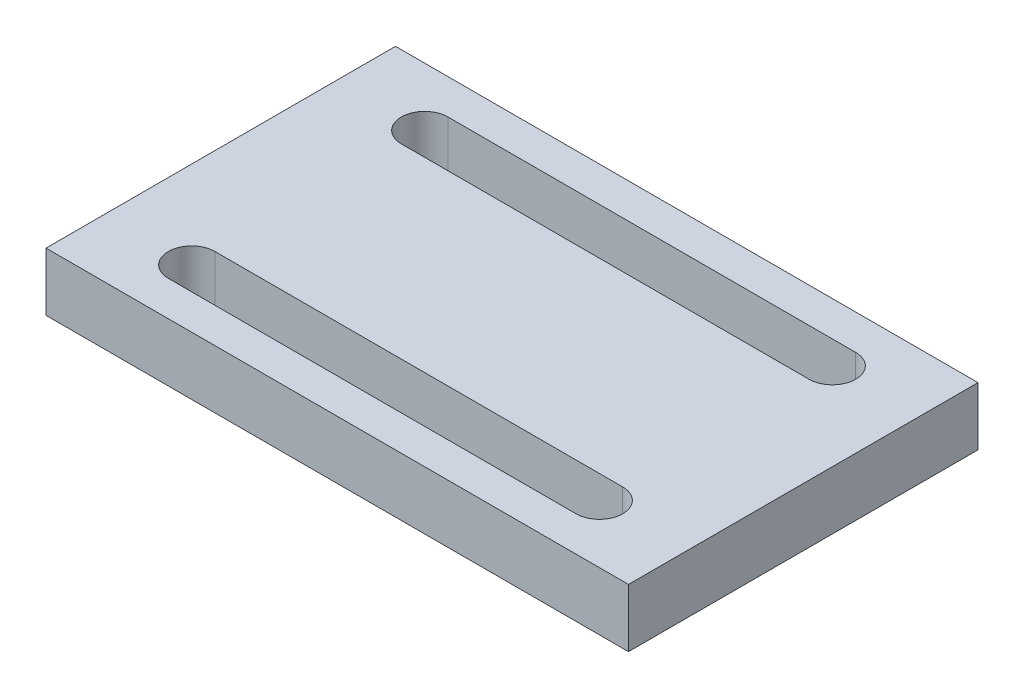
ISO-10303-21;
HEADER;
FILE_DESCRIPTION(('STEP AP214'),'2;1');
FILE_NAME('part.step','',(''),(''),'','','');
FILE_SCHEMA(('AUTOMOTIVE_DESIGN { 1 0 10303 214 1 1 1 1 }'));
ENDSEC;
DATA;
#1=APPLICATION_CONTEXT('core data for automotive mechanical design processes');
#2=APPLICATION_PROTOCOL_DEFINITION('international standard','automotive_design',2000,#1);
#3=PRODUCT_CONTEXT('',#1,'mechanical');
#4=PRODUCT('Part','Part','',(#3));
#5=PRODUCT_RELATED_PRODUCT_CATEGORY('part','',(#4));
#6=PRODUCT_DEFINITION_FORMATION('','',#4);
#7=PRODUCT_DEFINITION_CONTEXT('part definition',#1,'design');
#8=PRODUCT_DEFINITION('design','',#6,#7);
#9=PRODUCT_DEFINITION_SHAPE('','',#8);
#10=(LENGTH_UNIT() NAMED_UNIT(*) SI_UNIT(.MILLI.,.METRE.));
#11=(NAMED_UNIT(*) PLANE_ANGLE_UNIT() SI_UNIT($,.RADIAN.));
#12=(NAMED_UNIT(*) SI_UNIT($,.STERADIAN.) SOLID_ANGLE_UNIT());
#13=UNCERTAINTY_MEASURE_WITH_UNIT(LENGTH_MEASURE(1.E-05),#10,'distance_accuracy_value','');
#14=(GEOMETRIC_REPRESENTATION_CONTEXT(3) GLOBAL_UNCERTAINTY_ASSIGNED_CONTEXT((#13)) GLOBAL_UNIT_ASSIGNED_CONTEXT((#10,
#11,#12)) REPRESENTATION_CONTEXT('',''));
#15=CARTESIAN_POINT('',(0.,0.,0.));
#16=DIRECTION('',(0.,0.,1.));
#17=DIRECTION('',(1.,0.,0.));
#18=AXIS2_PLACEMENT_3D('',#15,#16,#17);
#19=CARTESIAN_POINT('',(0.,5.,0.));
#20=DIRECTION('',(0.,1.,0.));
#21=DIRECTION('',(0.,0.,1.));
#22=AXIS2_PLACEMENT_3D('',#19,#20,#21);
#23=PLANE('',#22);
#24=DIRECTION('',(0.,0.,1.));
#25=VECTOR('',#24,1.);
#26=CARTESIAN_POINT('',(0.,5.,-30.));
#27=LINE('',#26,#25);
#28=CARTESIAN_POINT('',(0.,5.,-30.));
#29=VERTEX_POINT('',#28);
#30=CARTESIAN_POINT('',(0.,5.,0.));
#31=VERTEX_POINT('',#30);
#32=EDGE_CURVE('E193',#29,#31,#27,.T.);
#33=ORIENTED_EDGE('',*,*,#32,.T.);
#34=DIRECTION('',(1.,0.,0.));
#35=VECTOR('',#34,1.);
#36=CARTESIAN_POINT('',(0.,5.,0.));
#37=LINE('',#36,#35);
#38=CARTESIAN_POINT('',(50.,5.,0.));
#39=VERTEX_POINT('',#38);
#40=EDGE_CURVE('E196',#31,#39,#37,.T.);
#41=ORIENTED_EDGE('',*,*,#40,.T.);
#42=DIRECTION('',(0.,0.,-1.));
#43=VECTOR('',#42,1.);
#44=CARTESIAN_POINT('',(50.,5.,0.));
#45=LINE('',#44,#43);
#46=CARTESIAN_POINT('',(50.,5.,-30.));
#47=VERTEX_POINT('',#46);
#48=EDGE_CURVE('E199',#39,#47,#45,.T.);
#49=ORIENTED_EDGE('',*,*,#48,.T.);
#50=DIRECTION('',(-1.,0.,0.));
#51=VECTOR('',#50,1.);
#52=CARTESIAN_POINT('',(50.,5.,-30.));
#53=LINE('',#52,#51);
#54=EDGE_CURVE('E201',#47,#29,#53,.T.);
#55=ORIENTED_EDGE('',*,*,#54,.T.);
#56=EDGE_LOOP('',(#33,#41,#49,#55));
#57=FACE_BOUND('',#56,.T.);
#58=DIRECTION('',(1.,0.,0.));
#59=VECTOR('',#58,1.);
#60=CARTESIAN_POINT('',(42.5,5.,-23.));
#61=LINE('',#60,#59);
#62=CARTESIAN_POINT('',(7.5,5.,-23.));
#63=VERTEX_POINT('',#62);
#64=CARTESIAN_POINT('',(42.5,5.,-23.));
#65=VERTEX_POINT('',#64);
#66=EDGE_CURVE('E164',#63,#65,#61,.T.);
#67=ORIENTED_EDGE('',*,*,#66,.F.);
#68=CARTESIAN_POINT('',(7.5,5.,-25.));
#69=DIRECTION('',(0.,1.,0.));
#70=DIRECTION('',(0.,0.,-1.));
#71=AXIS2_PLACEMENT_3D('',#68,#69,#70);
#72=CIRCLE('',#71,2.);
#73=CARTESIAN_POINT('',(7.5,5.,-27.));
#74=VERTEX_POINT('',#73);
#75=EDGE_CURVE('E162',#74,#63,#72,.T.);
#76=ORIENTED_EDGE('',*,*,#75,.F.);
#77=DIRECTION('',(-1.,0.,0.));
#78=VECTOR('',#77,1.);
#79=CARTESIAN_POINT('',(7.5,5.,-27.));
#80=LINE('',#79,#78);
#81=CARTESIAN_POINT('',(42.5,5.,-27.));
#82=VERTEX_POINT('',#81);
#83=EDGE_CURVE('E170',#82,#74,#80,.T.);
#84=ORIENTED_EDGE('',*,*,#83,.F.);
#85=CARTESIAN_POINT('',(42.5,5.,-25.));
#86=DIRECTION('',(0.,1.,0.));
#87=DIRECTION('',(0.,0.,-1.));
#88=AXIS2_PLACEMENT_3D('',#85,#86,#87);
#89=CIRCLE('',#88,2.);
#90=EDGE_CURVE('E167',#65,#82,#89,.T.);
#91=ORIENTED_EDGE('',*,*,#90,.F.);
#92=EDGE_LOOP('',(#67,#76,#84,#91));
#93=FACE_BOUND('',#92,.T.);
#94=DIRECTION('',(1.,0.,0.));
#95=VECTOR('',#94,1.);
#96=CARTESIAN_POINT('',(7.50000000000001,5.,-3.));
#97=LINE('',#96,#95);
#98=CARTESIAN_POINT('',(7.50000000000001,5.,-3.));
#99=VERTEX_POINT('',#98);
#100=CARTESIAN_POINT('',(42.5,5.,-3.));
#101=VERTEX_POINT('',#100);
#102=EDGE_CURVE('E134',#99,#101,#97,.T.);
#103=ORIENTED_EDGE('',*,*,#102,.F.);
#104=CARTESIAN_POINT('',(7.50000000000001,5.,-5.));
#105=DIRECTION('',(0.,1.,0.));
#106=DIRECTION('',(0.,0.,1.));
#107=AXIS2_PLACEMENT_3D('',#104,#105,#106);
#108=CIRCLE('',#107,2.);
#109=CARTESIAN_POINT('',(7.50000000000001,5.,-7.));
#110=VERTEX_POINT('',#109);
#111=EDGE_CURVE('E126',#110,#99,#108,.T.);
#112=ORIENTED_EDGE('',*,*,#111,.F.);
#113=DIRECTION('',(-1.,0.,0.));
#114=VECTOR('',#113,1.);
#115=CARTESIAN_POINT('',(42.5,5.,-7.00000000000001));
#116=LINE('',#115,#114);
#117=CARTESIAN_POINT('',(42.5,5.,-7.00000000000001));
#118=VERTEX_POINT('',#117);
#119=EDGE_CURVE('E148',#118,#110,#116,.T.);
#120=ORIENTED_EDGE('',*,*,#119,.F.);
#121=CARTESIAN_POINT('',(42.5,5.,-5.));
#122=DIRECTION('',(0.,1.,0.));
#123=DIRECTION('',(0.,0.,1.));
#124=AXIS2_PLACEMENT_3D('',#121,#122,#123);
#125=CIRCLE('',#124,2.);
#126=EDGE_CURVE('E146',#101,#118,#125,.T.);
#127=ORIENTED_EDGE('',*,*,#126,.F.);
#128=EDGE_LOOP('',(#103,#112,#120,#127));
#129=FACE_BOUND('',#128,.T.);
#130=ADVANCED_FACE('F37',(#57,#93,#129),#23,.T.);
#131=CARTESIAN_POINT('',(0.,0.,0.));
#132=DIRECTION('',(0.,1.,0.));
#133=DIRECTION('',(0.,0.,1.));
#134=AXIS2_PLACEMENT_3D('',#131,#132,#133);
#135=PLANE('',#134);
#136=CARTESIAN_POINT('',(7.5,0.,-25.));
#137=DIRECTION('',(0.,1.,0.));
#138=DIRECTION('',(0.,0.,-1.));
#139=AXIS2_PLACEMENT_3D('',#136,#137,#138);
#140=CIRCLE('',#139,2.);
#141=CARTESIAN_POINT('',(7.5,0.,-27.));
#142=VERTEX_POINT('',#141);
#143=CARTESIAN_POINT('',(7.5,0.,-23.));
#144=VERTEX_POINT('',#143);
#145=EDGE_CURVE('E142',#142,#144,#140,.T.);
#146=ORIENTED_EDGE('',*,*,#145,.T.);
#147=DIRECTION('',(1.,0.,0.));
#148=VECTOR('',#147,1.);
#149=CARTESIAN_POINT('',(42.5,0.,-23.));
#150=LINE('',#149,#148);
#151=CARTESIAN_POINT('',(42.5,0.,-23.));
#152=VERTEX_POINT('',#151);
#153=EDGE_CURVE('E175',#144,#152,#150,.T.);
#154=ORIENTED_EDGE('',*,*,#153,.T.);
#155=CARTESIAN_POINT('',(42.5,0.,-25.));
#156=DIRECTION('',(0.,1.,0.));
#157=DIRECTION('',(0.,0.,-1.));
#158=AXIS2_PLACEMENT_3D('',#155,#156,#157);
#159=CIRCLE('',#158,2.);
#160=CARTESIAN_POINT('',(42.5,0.,-27.));
#161=VERTEX_POINT('',#160);
#162=EDGE_CURVE('E178',#152,#161,#159,.T.);
#163=ORIENTED_EDGE('',*,*,#162,.T.);
#164=DIRECTION('',(-1.,0.,0.));
#165=VECTOR('',#164,1.);
#166=CARTESIAN_POINT('',(7.5,0.,-27.));
#167=LINE('',#166,#165);
#168=EDGE_CURVE('E165',#161,#142,#167,.T.);
#169=ORIENTED_EDGE('',*,*,#168,.T.);
#170=EDGE_LOOP('',(#146,#154,#163,#169));
#171=FACE_BOUND('',#170,.T.);
#172=DIRECTION('',(0.,0.,1.));
#173=VECTOR('',#172,1.);
#174=CARTESIAN_POINT('',(0.,0.,-30.));
#175=LINE('',#174,#173);
#176=CARTESIAN_POINT('',(0.,0.,-30.));
#177=VERTEX_POINT('',#176);
#178=CARTESIAN_POINT('',(0.,0.,0.));
#179=VERTEX_POINT('',#178);
#180=EDGE_CURVE('E192',#177,#179,#175,.T.);
#181=ORIENTED_EDGE('',*,*,#180,.F.);
#182=DIRECTION('',(-1.,0.,0.));
#183=VECTOR('',#182,1.);
#184=CARTESIAN_POINT('',(50.,0.,-30.));
#185=LINE('',#184,#183);
#186=CARTESIAN_POINT('',(50.,0.,-30.));
#187=VERTEX_POINT('',#186);
#188=EDGE_CURVE('E197',#187,#177,#185,.T.);
#189=ORIENTED_EDGE('',*,*,#188,.F.);
#190=DIRECTION('',(0.,0.,-1.));
#191=VECTOR('',#190,1.);
#192=CARTESIAN_POINT('',(50.,0.,0.));
#193=LINE('',#192,#191);
#194=CARTESIAN_POINT('',(50.,0.,0.));
#195=VERTEX_POINT('',#194);
#196=EDGE_CURVE('E208',#195,#187,#193,.T.);
#197=ORIENTED_EDGE('',*,*,#196,.F.);
#198=DIRECTION('',(1.,0.,0.));
#199=VECTOR('',#198,1.);
#200=CARTESIAN_POINT('',(0.,0.,0.));
#201=LINE('',#200,#199);
#202=EDGE_CURVE('E206',#179,#195,#201,.T.);
#203=ORIENTED_EDGE('',*,*,#202,.F.);
#204=EDGE_LOOP('',(#181,#189,#197,#203));
#205=FACE_BOUND('',#204,.T.);
#206=CARTESIAN_POINT('',(7.50000000000001,0.,-5.));
#207=DIRECTION('',(0.,1.,0.));
#208=DIRECTION('',(0.,0.,1.));
#209=AXIS2_PLACEMENT_3D('',#206,#207,#208);
#210=CIRCLE('',#209,2.);
#211=CARTESIAN_POINT('',(7.50000000000001,0.,-7.));
#212=VERTEX_POINT('',#211);
#213=CARTESIAN_POINT('',(7.50000000000001,0.,-3.));
#214=VERTEX_POINT('',#213);
#215=EDGE_CURVE('E60',#212,#214,#210,.T.);
#216=ORIENTED_EDGE('',*,*,#215,.T.);
#217=DIRECTION('',(1.,0.,0.));
#218=VECTOR('',#217,1.);
#219=CARTESIAN_POINT('',(7.50000000000001,0.,-3.));
#220=LINE('',#219,#218);
#221=CARTESIAN_POINT('',(42.5,0.,-3.));
#222=VERTEX_POINT('',#221);
#223=EDGE_CURVE('E141',#214,#222,#220,.T.);
#224=ORIENTED_EDGE('',*,*,#223,.T.);
#225=CARTESIAN_POINT('',(42.5,0.,-5.));
#226=DIRECTION('',(0.,1.,0.));
#227=DIRECTION('',(0.,0.,1.));
#228=AXIS2_PLACEMENT_3D('',#225,#226,#227);
#229=CIRCLE('',#228,2.);
#230=CARTESIAN_POINT('',(42.5,0.,-7.00000000000001));
#231=VERTEX_POINT('',#230);
#232=EDGE_CURVE('E154',#222,#231,#229,.T.);
#233=ORIENTED_EDGE('',*,*,#232,.T.);
#234=DIRECTION('',(-1.,0.,0.));
#235=VECTOR('',#234,1.);
#236=CARTESIAN_POINT('',(42.5,0.,-7.00000000000001));
#237=LINE('',#236,#235);
#238=EDGE_CURVE('E135',#231,#212,#237,.T.);
#239=ORIENTED_EDGE('',*,*,#238,.T.);
#240=EDGE_LOOP('',(#216,#224,#233,#239));
#241=FACE_BOUND('',#240,.T.);
#242=ADVANCED_FACE('F226',(#171,#205,#241),#135,.F.);
#243=CARTESIAN_POINT('',(0.,5.,-30.));
#244=DIRECTION('',(1.,0.,0.));
#245=DIRECTION('',(0.,0.,-1.));
#246=AXIS2_PLACEMENT_3D('',#243,#244,#245);
#247=PLANE('',#246);
#248=ORIENTED_EDGE('',*,*,#180,.T.);
#249=DIRECTION('',(0.,-1.,0.));
#250=VECTOR('',#249,1.);
#251=CARTESIAN_POINT('',(0.,5.,0.));
#252=LINE('',#251,#250);
#253=EDGE_CURVE('E11',#31,#179,#252,.T.);
#254=ORIENTED_EDGE('',*,*,#253,.F.);
#255=ORIENTED_EDGE('',*,*,#32,.F.);
#256=DIRECTION('',(0.,-1.,0.));
#257=VECTOR('',#256,1.);
#258=CARTESIAN_POINT('',(0.,5.,-30.));
#259=LINE('',#258,#257);
#260=EDGE_CURVE('E203',#29,#177,#259,.T.);
#261=ORIENTED_EDGE('',*,*,#260,.T.);
#262=EDGE_LOOP('',(#248,#254,#255,#261));
#263=FACE_BOUND('',#262,.T.);
#264=ADVANCED_FACE('F39',(#263),#247,.F.);
#265=CARTESIAN_POINT('',(0.,5.,0.));
#266=DIRECTION('',(0.,0.,-1.));
#267=DIRECTION('',(-1.,0.,0.));
#268=AXIS2_PLACEMENT_3D('',#265,#266,#267);
#269=PLANE('',#268);
#270=ORIENTED_EDGE('',*,*,#202,.T.);
#271=DIRECTION('',(0.,-1.,0.));
#272=VECTOR('',#271,1.);
#273=CARTESIAN_POINT('',(50.,5.,0.));
#274=LINE('',#273,#272);
#275=EDGE_CURVE('E45',#39,#195,#274,.T.);
#276=ORIENTED_EDGE('',*,*,#275,.F.);
#277=ORIENTED_EDGE('',*,*,#40,.F.);
#278=ORIENTED_EDGE('',*,*,#253,.T.);
#279=EDGE_LOOP('',(#270,#276,#277,#278));
#280=FACE_BOUND('',#279,.T.);
#281=ADVANCED_FACE('F237',(#280),#269,.F.);
#282=CARTESIAN_POINT('',(50.,5.,0.));
#283=DIRECTION('',(-1.,0.,0.));
#284=DIRECTION('',(0.,0.,1.));
#285=AXIS2_PLACEMENT_3D('',#282,#283,#284);
#286=PLANE('',#285);
#287=ORIENTED_EDGE('',*,*,#196,.T.);
#288=DIRECTION('',(0.,-1.,0.));
#289=VECTOR('',#288,1.);
#290=CARTESIAN_POINT('',(50.,5.,-30.));
#291=LINE('',#290,#289);
#292=EDGE_CURVE('E213',#47,#187,#291,.T.);
#293=ORIENTED_EDGE('',*,*,#292,.F.);
#294=ORIENTED_EDGE('',*,*,#48,.F.);
#295=ORIENTED_EDGE('',*,*,#275,.T.);
#296=EDGE_LOOP('',(#287,#293,#294,#295));
#297=FACE_BOUND('',#296,.T.);
#298=ADVANCED_FACE('F220',(#297),#286,.F.);
#299=CARTESIAN_POINT('',(50.,5.,-30.));
#300=DIRECTION('',(0.,0.,1.));
#301=DIRECTION('',(1.,0.,0.));
#302=AXIS2_PLACEMENT_3D('',#299,#300,#301);
#303=PLANE('',#302);
#304=ORIENTED_EDGE('',*,*,#188,.T.);
#305=ORIENTED_EDGE('',*,*,#260,.F.);
#306=ORIENTED_EDGE('',*,*,#54,.F.);
#307=ORIENTED_EDGE('',*,*,#292,.T.);
#308=EDGE_LOOP('',(#304,#305,#306,#307));
#309=FACE_BOUND('',#308,.T.);
#310=ADVANCED_FACE('F230',(#309),#303,.F.);
#311=CARTESIAN_POINT('',(7.5,5.,-25.));
#312=DIRECTION('',(0.,-1.,0.));
#313=DIRECTION('',(0.,0.,-1.));
#314=AXIS2_PLACEMENT_3D('',#311,#312,#313);
#315=CYLINDRICAL_SURFACE('',#314,2.);
#316=ORIENTED_EDGE('',*,*,#145,.F.);
#317=DIRECTION('',(0.,-1.,0.));
#318=VECTOR('',#317,1.);
#319=CARTESIAN_POINT('',(7.5,5.,-27.));
#320=LINE('',#319,#318);
#321=EDGE_CURVE('E172',#74,#142,#320,.T.);
#322=ORIENTED_EDGE('',*,*,#321,.F.);
#323=ORIENTED_EDGE('',*,*,#75,.T.);
#324=DIRECTION('',(0.,-1.,0.));
#325=VECTOR('',#324,1.);
#326=CARTESIAN_POINT('',(7.5,5.,-23.));
#327=LINE('',#326,#325);
#328=EDGE_CURVE('E189',#63,#144,#327,.T.);
#329=ORIENTED_EDGE('',*,*,#328,.T.);
#330=EDGE_LOOP('',(#316,#322,#323,#329));
#331=FACE_BOUND('',#330,.T.);
#332=ADVANCED_FACE('F252',(#331),#315,.F.);
#333=CARTESIAN_POINT('',(42.5,5.,-23.));
#334=DIRECTION('',(0.,0.,-1.));
#335=DIRECTION('',(-1.,0.,0.));
#336=AXIS2_PLACEMENT_3D('',#333,#334,#335);
#337=PLANE('',#336);
#338=ORIENTED_EDGE('',*,*,#153,.F.);
#339=ORIENTED_EDGE('',*,*,#328,.F.);
#340=ORIENTED_EDGE('',*,*,#66,.T.);
#341=DIRECTION('',(0.,-1.,0.));
#342=VECTOR('',#341,1.);
#343=CARTESIAN_POINT('',(42.5,5.,-23.));
#344=LINE('',#343,#342);
#345=EDGE_CURVE('E187',#65,#152,#344,.T.);
#346=ORIENTED_EDGE('',*,*,#345,.T.);
#347=EDGE_LOOP('',(#338,#339,#340,#346));
#348=FACE_BOUND('',#347,.T.);
#349=ADVANCED_FACE('F259',(#348),#337,.T.);
#350=CARTESIAN_POINT('',(42.5,5.,-25.));
#351=DIRECTION('',(0.,-1.,0.));
#352=DIRECTION('',(0.,0.,-1.));
#353=AXIS2_PLACEMENT_3D('',#350,#351,#352);
#354=CYLINDRICAL_SURFACE('',#353,2.);
#355=ORIENTED_EDGE('',*,*,#162,.F.);
#356=ORIENTED_EDGE('',*,*,#345,.F.);
#357=ORIENTED_EDGE('',*,*,#90,.T.);
#358=DIRECTION('',(0.,-1.,0.));
#359=VECTOR('',#358,1.);
#360=CARTESIAN_POINT('',(42.5,5.,-27.));
#361=LINE('',#360,#359);
#362=EDGE_CURVE('E185',#82,#161,#361,.T.);
#363=ORIENTED_EDGE('',*,*,#362,.T.);
#364=EDGE_LOOP('',(#355,#356,#357,#363));
#365=FACE_BOUND('',#364,.T.);
#366=ADVANCED_FACE('F264',(#365),#354,.F.);
#367=CARTESIAN_POINT('',(7.5,5.,-27.));
#368=DIRECTION('',(0.,0.,1.));
#369=DIRECTION('',(1.,0.,0.));
#370=AXIS2_PLACEMENT_3D('',#367,#368,#369);
#371=PLANE('',#370);
#372=ORIENTED_EDGE('',*,*,#168,.F.);
#373=ORIENTED_EDGE('',*,*,#362,.F.);
#374=ORIENTED_EDGE('',*,*,#83,.T.);
#375=ORIENTED_EDGE('',*,*,#321,.T.);
#376=EDGE_LOOP('',(#372,#373,#374,#375));
#377=FACE_BOUND('',#376,.T.);
#378=ADVANCED_FACE('F271',(#377),#371,.T.);
#379=CARTESIAN_POINT('',(7.50000000000001,5.,-5.));
#380=DIRECTION('',(0.,-1.,0.));
#381=DIRECTION('',(0.,0.,-1.));
#382=AXIS2_PLACEMENT_3D('',#379,#380,#381);
#383=CYLINDRICAL_SURFACE('',#382,2.);
#384=ORIENTED_EDGE('',*,*,#215,.F.);
#385=DIRECTION('',(0.,-1.,0.));
#386=VECTOR('',#385,1.);
#387=CARTESIAN_POINT('',(7.50000000000001,5.,-7.));
#388=LINE('',#387,#386);
#389=EDGE_CURVE('E130',#110,#212,#388,.T.);
#390=ORIENTED_EDGE('',*,*,#389,.F.);
#391=ORIENTED_EDGE('',*,*,#111,.T.);
#392=DIRECTION('',(0.,-1.,0.));
#393=VECTOR('',#392,1.);
#394=CARTESIAN_POINT('',(7.50000000000001,5.,-3.));
#395=LINE('',#394,#393);
#396=EDGE_CURVE('E129',#99,#214,#395,.T.);
#397=ORIENTED_EDGE('',*,*,#396,.T.);
#398=EDGE_LOOP('',(#384,#390,#391,#397));
#399=FACE_BOUND('',#398,.T.);
#400=ADVANCED_FACE('F128',(#399),#383,.F.);
#401=CARTESIAN_POINT('',(7.50000000000001,5.,-3.));
#402=DIRECTION('',(0.,0.,-1.));
#403=DIRECTION('',(-1.,0.,0.));
#404=AXIS2_PLACEMENT_3D('',#401,#402,#403);
#405=PLANE('',#404);
#406=ORIENTED_EDGE('',*,*,#223,.F.);
#407=ORIENTED_EDGE('',*,*,#396,.F.);
#408=ORIENTED_EDGE('',*,*,#102,.T.);
#409=DIRECTION('',(0.,-1.,0.));
#410=VECTOR('',#409,1.);
#411=CARTESIAN_POINT('',(42.5,5.,-3.));
#412=LINE('',#411,#410);
#413=EDGE_CURVE('E143',#101,#222,#412,.T.);
#414=ORIENTED_EDGE('',*,*,#413,.T.);
#415=EDGE_LOOP('',(#406,#407,#408,#414));
#416=FACE_BOUND('',#415,.T.);
#417=ADVANCED_FACE('F138',(#416),#405,.T.);
#418=CARTESIAN_POINT('',(42.5,5.,-5.));
#419=DIRECTION('',(0.,-1.,0.));
#420=DIRECTION('',(0.,0.,-1.));
#421=AXIS2_PLACEMENT_3D('',#418,#419,#420);
#422=CYLINDRICAL_SURFACE('',#421,2.);
#423=ORIENTED_EDGE('',*,*,#232,.F.);
#424=ORIENTED_EDGE('',*,*,#413,.F.);
#425=ORIENTED_EDGE('',*,*,#126,.T.);
#426=DIRECTION('',(0.,-1.,0.));
#427=VECTOR('',#426,1.);
#428=CARTESIAN_POINT('',(42.5,5.,-7.00000000000001));
#429=LINE('',#428,#427);
#430=EDGE_CURVE('E52',#118,#231,#429,.T.);
#431=ORIENTED_EDGE('',*,*,#430,.T.);
#432=EDGE_LOOP('',(#423,#424,#425,#431));
#433=FACE_BOUND('',#432,.T.);
#434=ADVANCED_FACE('F289',(#433),#422,.F.);
#435=CARTESIAN_POINT('',(42.5,5.,-7.00000000000001));
#436=DIRECTION('',(0.,0.,1.));
#437=DIRECTION('',(1.,0.,0.));
#438=AXIS2_PLACEMENT_3D('',#435,#436,#437);
#439=PLANE('',#438);
#440=ORIENTED_EDGE('',*,*,#238,.F.);
#441=ORIENTED_EDGE('',*,*,#430,.F.);
#442=ORIENTED_EDGE('',*,*,#119,.T.);
#443=ORIENTED_EDGE('',*,*,#389,.T.);
#444=EDGE_LOOP('',(#440,#441,#442,#443));
#445=FACE_BOUND('',#444,.T.);
#446=ADVANCED_FACE('F292',(#445),#439,.T.);
#447=CLOSED_SHELL('',(#130,#242,#264,#281,#298,#310,#332,#349,#366,#378,#400,#417,#434,#446));
#448=MANIFOLD_SOLID_BREP('B2',#447);
#449=ADVANCED_BREP_SHAPE_REPRESENTATION('',(#18,#448),#14);
#450=SHAPE_DEFINITION_REPRESENTATION(#9,#449);
ENDSEC;
END-ISO-10303-21;
